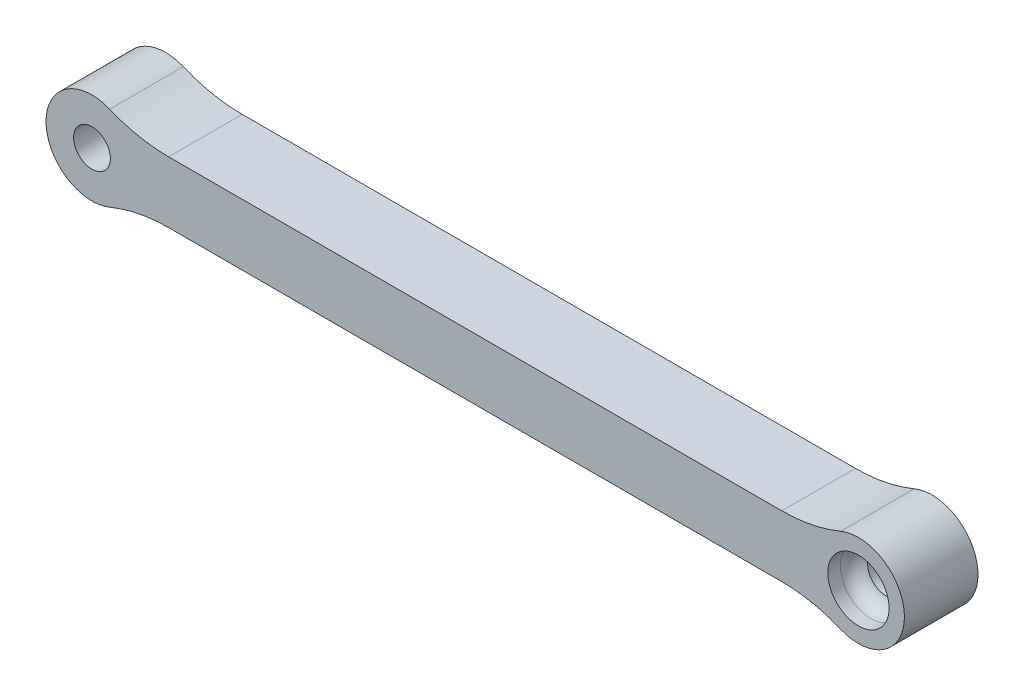
ISO-10303-21;
HEADER;
FILE_DESCRIPTION(('STEP AP214'),'2;1');
FILE_NAME('part.step','',(''),(''),'','','');
FILE_SCHEMA(('AUTOMOTIVE_DESIGN { 1 0 10303 214 1 1 1 1 }'));
ENDSEC;
DATA;
#1=APPLICATION_CONTEXT('core data for automotive mechanical design processes');
#2=APPLICATION_PROTOCOL_DEFINITION('international standard','automotive_design',2000,#1);
#3=PRODUCT_CONTEXT('',#1,'mechanical');
#4=PRODUCT('Part','Part','',(#3));
#5=PRODUCT_RELATED_PRODUCT_CATEGORY('part','',(#4));
#6=PRODUCT_DEFINITION_FORMATION('','',#4);
#7=PRODUCT_DEFINITION_CONTEXT('part definition',#1,'design');
#8=PRODUCT_DEFINITION('design','',#6,#7);
#9=PRODUCT_DEFINITION_SHAPE('','',#8);
#10=(LENGTH_UNIT() NAMED_UNIT(*) SI_UNIT(.MILLI.,.METRE.));
#11=(NAMED_UNIT(*) PLANE_ANGLE_UNIT() SI_UNIT($,.RADIAN.));
#12=(NAMED_UNIT(*) SI_UNIT($,.STERADIAN.) SOLID_ANGLE_UNIT());
#13=UNCERTAINTY_MEASURE_WITH_UNIT(LENGTH_MEASURE(1.E-05),#10,'distance_accuracy_value','');
#14=(GEOMETRIC_REPRESENTATION_CONTEXT(3) GLOBAL_UNCERTAINTY_ASSIGNED_CONTEXT((#13)) GLOBAL_UNIT_ASSIGNED_CONTEXT((#10,
#11,#12)) REPRESENTATION_CONTEXT('',''));
#15=CARTESIAN_POINT('',(0.,0.,0.));
#16=DIRECTION('',(0.,0.,1.));
#17=DIRECTION('',(1.,0.,0.));
#18=AXIS2_PLACEMENT_3D('',#15,#16,#17);
#19=CARTESIAN_POINT('',(50.,0.,4.8));
#20=DIRECTION('',(0.,0.,-1.));
#21=DIRECTION('',(-1.,0.,0.));
#22=AXIS2_PLACEMENT_3D('',#19,#20,#21);
#23=CYLINDRICAL_SURFACE('',#22,1.2);
#24=CARTESIAN_POINT('',(50.,0.,0.));
#25=DIRECTION('',(0.,0.,1.));
#26=DIRECTION('',(1.,0.,0.));
#27=AXIS2_PLACEMENT_3D('',#24,#25,#26);
#28=CIRCLE('',#27,1.2);
#29=CARTESIAN_POINT('',(51.2,0.,0.));
#30=VERTEX_POINT('',#29);
#31=EDGE_CURVE('E168',#30,#30,#28,.T.);
#32=ORIENTED_EDGE('',*,*,#31,.F.);
#33=EDGE_LOOP('',(#32));
#34=FACE_BOUND('',#33,.T.);
#35=CARTESIAN_POINT('',(50.,0.,3.));
#36=DIRECTION('',(0.,0.,1.));
#37=DIRECTION('',(1.,0.,0.));
#38=AXIS2_PLACEMENT_3D('',#35,#36,#37);
#39=CIRCLE('',#38,1.2);
#40=CARTESIAN_POINT('',(51.2,0.,3.));
#41=VERTEX_POINT('',#40);
#42=EDGE_CURVE('E166',#41,#41,#39,.T.);
#43=ORIENTED_EDGE('',*,*,#42,.T.);
#44=EDGE_LOOP('',(#43));
#45=FACE_BOUND('',#44,.T.);
#46=ADVANCED_FACE('F39',(#34,#45),#23,.F.);
#47=CARTESIAN_POINT('',(5.,12.,4.8));
#48=DIRECTION('',(0.,0.,-1.));
#49=DIRECTION('',(-1.,0.,0.));
#50=AXIS2_PLACEMENT_3D('',#47,#48,#49);
#51=PLANE('',#50);
#52=CARTESIAN_POINT('',(50.,0.,4.8));
#53=DIRECTION('',(0.,0.,1.));
#54=DIRECTION('',(1.,0.,0.));
#55=AXIS2_PLACEMENT_3D('',#52,#53,#54);
#56=CIRCLE('',#55,2.);
#57=CARTESIAN_POINT('',(52.,0.,4.8));
#58=VERTEX_POINT('',#57);
#59=EDGE_CURVE('E169',#58,#58,#56,.T.);
#60=ORIENTED_EDGE('',*,*,#59,.F.);
#61=EDGE_LOOP('',(#60));
#62=FACE_BOUND('',#61,.T.);
#63=CARTESIAN_POINT('',(5.,12.,4.8));
#64=DIRECTION('',(0.,0.,-1.));
#65=DIRECTION('',(-1.,0.,0.));
#66=AXIS2_PLACEMENT_3D('',#63,#64,#65);
#67=CIRCLE('',#66,10.);
#68=CARTESIAN_POINT('',(5.,2.,4.8));
#69=VERTEX_POINT('',#68);
#70=CARTESIAN_POINT('',(1.15384615384616,2.76923076923077,4.8));
#71=VERTEX_POINT('',#70);
#72=EDGE_CURVE('E153',#69,#71,#67,.T.);
#73=ORIENTED_EDGE('',*,*,#72,.T.);
#74=CARTESIAN_POINT('',(0.,0.,4.8));
#75=DIRECTION('',(0.,0.,1.));
#76=DIRECTION('',(1.,0.,0.));
#77=AXIS2_PLACEMENT_3D('',#74,#75,#76);
#78=CIRCLE('',#77,3.);
#79=CARTESIAN_POINT('',(1.15384615384616,-2.76923076923077,4.8));
#80=VERTEX_POINT('',#79);
#81=EDGE_CURVE('E100',#71,#80,#78,.T.);
#82=ORIENTED_EDGE('',*,*,#81,.T.);
#83=CARTESIAN_POINT('',(5.,-12.,4.8));
#84=DIRECTION('',(0.,0.,-1.));
#85=DIRECTION('',(1.,0.,0.));
#86=AXIS2_PLACEMENT_3D('',#83,#84,#85);
#87=CIRCLE('',#86,10.);
#88=CARTESIAN_POINT('',(5.,-2.,4.8));
#89=VERTEX_POINT('',#88);
#90=EDGE_CURVE('E186',#80,#89,#87,.T.);
#91=ORIENTED_EDGE('',*,*,#90,.T.);
#92=DIRECTION('',(1.,0.,0.));
#93=VECTOR('',#92,1.);
#94=CARTESIAN_POINT('',(5.,-2.,4.8));
#95=LINE('',#94,#93);
#96=CARTESIAN_POINT('',(45.,-2.,4.8));
#97=VERTEX_POINT('',#96);
#98=EDGE_CURVE('E188',#89,#97,#95,.T.);
#99=ORIENTED_EDGE('',*,*,#98,.T.);
#100=CARTESIAN_POINT('',(45.,-12.,4.8));
#101=DIRECTION('',(0.,0.,-1.));
#102=DIRECTION('',(1.,0.,0.));
#103=AXIS2_PLACEMENT_3D('',#100,#101,#102);
#104=CIRCLE('',#103,10.);
#105=CARTESIAN_POINT('',(48.8461538461539,-2.76923076923076,4.8));
#106=VERTEX_POINT('',#105);
#107=EDGE_CURVE('E120',#97,#106,#104,.T.);
#108=ORIENTED_EDGE('',*,*,#107,.T.);
#109=CARTESIAN_POINT('',(50.,0.,4.8));
#110=DIRECTION('',(0.,0.,1.));
#111=DIRECTION('',(1.,0.,0.));
#112=AXIS2_PLACEMENT_3D('',#109,#110,#111);
#113=CIRCLE('',#112,2.99999999999999);
#114=CARTESIAN_POINT('',(48.8461538461539,2.76923076923076,4.8));
#115=VERTEX_POINT('',#114);
#116=EDGE_CURVE('E113',#106,#115,#113,.T.);
#117=ORIENTED_EDGE('',*,*,#116,.T.);
#118=CARTESIAN_POINT('',(45.,12.,4.8));
#119=DIRECTION('',(0.,0.,-1.));
#120=DIRECTION('',(1.,0.,0.));
#121=AXIS2_PLACEMENT_3D('',#118,#119,#120);
#122=CIRCLE('',#121,10.);
#123=CARTESIAN_POINT('',(45.,2.,4.8));
#124=VERTEX_POINT('',#123);
#125=EDGE_CURVE('E118',#115,#124,#122,.T.);
#126=ORIENTED_EDGE('',*,*,#125,.T.);
#127=DIRECTION('',(-1.,0.,0.));
#128=VECTOR('',#127,1.);
#129=CARTESIAN_POINT('',(5.,2.,4.8));
#130=LINE('',#129,#128);
#131=EDGE_CURVE('E56',#124,#69,#130,.T.);
#132=ORIENTED_EDGE('',*,*,#131,.T.);
#133=EDGE_LOOP('',(#73,#82,#91,#99,#108,#117,#126,#132));
#134=FACE_BOUND('',#133,.T.);
#135=CARTESIAN_POINT('',(0.,0.,4.8));
#136=DIRECTION('',(0.,0.,1.));
#137=DIRECTION('',(1.,0.,0.));
#138=AXIS2_PLACEMENT_3D('',#135,#136,#137);
#139=CIRCLE('',#138,1.2);
#140=CARTESIAN_POINT('',(1.2,0.,4.8));
#141=VERTEX_POINT('',#140);
#142=EDGE_CURVE('E142',#141,#141,#139,.T.);
#143=ORIENTED_EDGE('',*,*,#142,.F.);
#144=EDGE_LOOP('',(#143));
#145=FACE_BOUND('',#144,.T.);
#146=ADVANCED_FACE('F115',(#62,#134,#145),#51,.F.);
#147=CARTESIAN_POINT('',(5.,12.,0.));
#148=DIRECTION('',(0.,0.,-1.));
#149=DIRECTION('',(-1.,0.,0.));
#150=AXIS2_PLACEMENT_3D('',#147,#148,#149);
#151=PLANE('',#150);
#152=CARTESIAN_POINT('',(0.,0.,0.));
#153=DIRECTION('',(0.,0.,1.));
#154=DIRECTION('',(1.,0.,0.));
#155=AXIS2_PLACEMENT_3D('',#152,#153,#154);
#156=CIRCLE('',#155,1.2);
#157=CARTESIAN_POINT('',(1.2,0.,0.));
#158=VERTEX_POINT('',#157);
#159=EDGE_CURVE('E173',#158,#158,#156,.T.);
#160=ORIENTED_EDGE('',*,*,#159,.T.);
#161=EDGE_LOOP('',(#160));
#162=FACE_BOUND('',#161,.T.);
#163=CARTESIAN_POINT('',(5.,12.,0.));
#164=DIRECTION('',(0.,0.,-1.));
#165=DIRECTION('',(-1.,0.,0.));
#166=AXIS2_PLACEMENT_3D('',#163,#164,#165);
#167=CIRCLE('',#166,10.);
#168=CARTESIAN_POINT('',(5.,2.,0.));
#169=VERTEX_POINT('',#168);
#170=CARTESIAN_POINT('',(1.15384615384616,2.76923076923077,0.));
#171=VERTEX_POINT('',#170);
#172=EDGE_CURVE('E138',#169,#171,#167,.T.);
#173=ORIENTED_EDGE('',*,*,#172,.F.);
#174=DIRECTION('',(-1.,0.,0.));
#175=VECTOR('',#174,1.);
#176=CARTESIAN_POINT('',(5.,2.,0.));
#177=LINE('',#176,#175);
#178=CARTESIAN_POINT('',(45.,2.,0.));
#179=VERTEX_POINT('',#178);
#180=EDGE_CURVE('E91',#179,#169,#177,.T.);
#181=ORIENTED_EDGE('',*,*,#180,.F.);
#182=CARTESIAN_POINT('',(45.,12.,0.));
#183=DIRECTION('',(0.,0.,-1.));
#184=DIRECTION('',(1.,0.,0.));
#185=AXIS2_PLACEMENT_3D('',#182,#183,#184);
#186=CIRCLE('',#185,10.);
#187=CARTESIAN_POINT('',(48.8461538461539,2.76923076923076,0.));
#188=VERTEX_POINT('',#187);
#189=EDGE_CURVE('E85',#188,#179,#186,.T.);
#190=ORIENTED_EDGE('',*,*,#189,.F.);
#191=CARTESIAN_POINT('',(50.,0.,0.));
#192=DIRECTION('',(0.,0.,1.));
#193=DIRECTION('',(1.,0.,0.));
#194=AXIS2_PLACEMENT_3D('',#191,#192,#193);
#195=CIRCLE('',#194,2.99999999999999);
#196=CARTESIAN_POINT('',(48.8461538461539,-2.76923076923076,0.));
#197=VERTEX_POINT('',#196);
#198=EDGE_CURVE('E128',#197,#188,#195,.T.);
#199=ORIENTED_EDGE('',*,*,#198,.F.);
#200=CARTESIAN_POINT('',(45.,-12.,0.));
#201=DIRECTION('',(0.,0.,-1.));
#202=DIRECTION('',(1.,0.,0.));
#203=AXIS2_PLACEMENT_3D('',#200,#201,#202);
#204=CIRCLE('',#203,10.);
#205=CARTESIAN_POINT('',(45.,-2.,0.));
#206=VERTEX_POINT('',#205);
#207=EDGE_CURVE('E148',#206,#197,#204,.T.);
#208=ORIENTED_EDGE('',*,*,#207,.F.);
#209=DIRECTION('',(1.,0.,0.));
#210=VECTOR('',#209,1.);
#211=CARTESIAN_POINT('',(5.,-2.,0.));
#212=LINE('',#211,#210);
#213=CARTESIAN_POINT('',(5.,-2.,0.));
#214=VERTEX_POINT('',#213);
#215=EDGE_CURVE('E146',#214,#206,#212,.T.);
#216=ORIENTED_EDGE('',*,*,#215,.F.);
#217=CARTESIAN_POINT('',(5.,-12.,0.));
#218=DIRECTION('',(0.,0.,-1.));
#219=DIRECTION('',(1.,0.,0.));
#220=AXIS2_PLACEMENT_3D('',#217,#218,#219);
#221=CIRCLE('',#220,10.);
#222=CARTESIAN_POINT('',(1.15384615384616,-2.76923076923077,0.));
#223=VERTEX_POINT('',#222);
#224=EDGE_CURVE('E144',#223,#214,#221,.T.);
#225=ORIENTED_EDGE('',*,*,#224,.F.);
#226=CARTESIAN_POINT('',(0.,0.,0.));
#227=DIRECTION('',(0.,0.,1.));
#228=DIRECTION('',(1.,0.,0.));
#229=AXIS2_PLACEMENT_3D('',#226,#227,#228);
#230=CIRCLE('',#229,3.);
#231=EDGE_CURVE('E141',#171,#223,#230,.T.);
#232=ORIENTED_EDGE('',*,*,#231,.F.);
#233=EDGE_LOOP('',(#173,#181,#190,#199,#208,#216,#225,#232));
#234=FACE_BOUND('',#233,.T.);
#235=ORIENTED_EDGE('',*,*,#31,.T.);
#236=EDGE_LOOP('',(#235));
#237=FACE_BOUND('',#236,.T.);
#238=ADVANCED_FACE('F201',(#162,#234,#237),#151,.T.);
#239=CARTESIAN_POINT('',(5.,12.,4.8));
#240=DIRECTION('',(0.,0.,-1.));
#241=DIRECTION('',(-1.,0.,0.));
#242=AXIS2_PLACEMENT_3D('',#239,#240,#241);
#243=CYLINDRICAL_SURFACE('',#242,10.);
#244=ORIENTED_EDGE('',*,*,#172,.T.);
#245=DIRECTION('',(0.,0.,-1.));
#246=VECTOR('',#245,1.);
#247=CARTESIAN_POINT('',(1.15384615384616,2.76923076923077,4.8));
#248=LINE('',#247,#246);
#249=EDGE_CURVE('E48',#71,#171,#248,.T.);
#250=ORIENTED_EDGE('',*,*,#249,.F.);
#251=ORIENTED_EDGE('',*,*,#72,.F.);
#252=DIRECTION('',(0.,0.,-1.));
#253=VECTOR('',#252,1.);
#254=CARTESIAN_POINT('',(5.,2.,4.8));
#255=LINE('',#254,#253);
#256=EDGE_CURVE('E134',#69,#169,#255,.T.);
#257=ORIENTED_EDGE('',*,*,#256,.T.);
#258=EDGE_LOOP('',(#244,#250,#251,#257));
#259=FACE_BOUND('',#258,.T.);
#260=ADVANCED_FACE('F206',(#259),#243,.F.);
#261=CARTESIAN_POINT('',(0.,0.,4.8));
#262=DIRECTION('',(0.,0.,-1.));
#263=DIRECTION('',(-1.,0.,0.));
#264=AXIS2_PLACEMENT_3D('',#261,#262,#263);
#265=CYLINDRICAL_SURFACE('',#264,3.);
#266=ORIENTED_EDGE('',*,*,#231,.T.);
#267=DIRECTION('',(0.,0.,-1.));
#268=VECTOR('',#267,1.);
#269=CARTESIAN_POINT('',(1.15384615384616,-2.76923076923077,4.8));
#270=LINE('',#269,#268);
#271=EDGE_CURVE('E163',#80,#223,#270,.T.);
#272=ORIENTED_EDGE('',*,*,#271,.F.);
#273=ORIENTED_EDGE('',*,*,#81,.F.);
#274=ORIENTED_EDGE('',*,*,#249,.T.);
#275=EDGE_LOOP('',(#266,#272,#273,#274));
#276=FACE_BOUND('',#275,.T.);
#277=ADVANCED_FACE('F236',(#276),#265,.T.);
#278=CARTESIAN_POINT('',(5.,-12.,4.8));
#279=DIRECTION('',(0.,0.,-1.));
#280=DIRECTION('',(-1.,0.,0.));
#281=AXIS2_PLACEMENT_3D('',#278,#279,#280);
#282=CYLINDRICAL_SURFACE('',#281,10.);
#283=ORIENTED_EDGE('',*,*,#224,.T.);
#284=DIRECTION('',(0.,0.,-1.));
#285=VECTOR('',#284,1.);
#286=CARTESIAN_POINT('',(5.,-2.,4.8));
#287=LINE('',#286,#285);
#288=EDGE_CURVE('E160',#89,#214,#287,.T.);
#289=ORIENTED_EDGE('',*,*,#288,.F.);
#290=ORIENTED_EDGE('',*,*,#90,.F.);
#291=ORIENTED_EDGE('',*,*,#271,.T.);
#292=EDGE_LOOP('',(#283,#289,#290,#291));
#293=FACE_BOUND('',#292,.T.);
#294=ADVANCED_FACE('F242',(#293),#282,.F.);
#295=CARTESIAN_POINT('',(5.,-2.,4.8));
#296=DIRECTION('',(0.,1.,0.));
#297=DIRECTION('',(0.,0.,1.));
#298=AXIS2_PLACEMENT_3D('',#295,#296,#297);
#299=PLANE('',#298);
#300=ORIENTED_EDGE('',*,*,#215,.T.);
#301=DIRECTION('',(0.,0.,-1.));
#302=VECTOR('',#301,1.);
#303=CARTESIAN_POINT('',(45.,-2.,4.8));
#304=LINE('',#303,#302);
#305=EDGE_CURVE('E157',#97,#206,#304,.T.);
#306=ORIENTED_EDGE('',*,*,#305,.F.);
#307=ORIENTED_EDGE('',*,*,#98,.F.);
#308=ORIENTED_EDGE('',*,*,#288,.T.);
#309=EDGE_LOOP('',(#300,#306,#307,#308));
#310=FACE_BOUND('',#309,.T.);
#311=ADVANCED_FACE('F194',(#310),#299,.F.);
#312=CARTESIAN_POINT('',(45.,-12.,4.8));
#313=DIRECTION('',(0.,0.,-1.));
#314=DIRECTION('',(-1.,0.,0.));
#315=AXIS2_PLACEMENT_3D('',#312,#313,#314);
#316=CYLINDRICAL_SURFACE('',#315,10.);
#317=ORIENTED_EDGE('',*,*,#207,.T.);
#318=DIRECTION('',(0.,0.,-1.));
#319=VECTOR('',#318,1.);
#320=CARTESIAN_POINT('',(48.8461538461539,-2.76923076923076,4.8));
#321=LINE('',#320,#319);
#322=EDGE_CURVE('E129',#106,#197,#321,.T.);
#323=ORIENTED_EDGE('',*,*,#322,.F.);
#324=ORIENTED_EDGE('',*,*,#107,.F.);
#325=ORIENTED_EDGE('',*,*,#305,.T.);
#326=EDGE_LOOP('',(#317,#323,#324,#325));
#327=FACE_BOUND('',#326,.T.);
#328=ADVANCED_FACE('F198',(#327),#316,.F.);
#329=CARTESIAN_POINT('',(50.,0.,4.8));
#330=DIRECTION('',(0.,0.,-1.));
#331=DIRECTION('',(-1.,0.,0.));
#332=AXIS2_PLACEMENT_3D('',#329,#330,#331);
#333=CYLINDRICAL_SURFACE('',#332,2.99999999999999);
#334=ORIENTED_EDGE('',*,*,#198,.T.);
#335=DIRECTION('',(0.,0.,-1.));
#336=VECTOR('',#335,1.);
#337=CARTESIAN_POINT('',(48.8461538461539,2.76923076923076,4.8));
#338=LINE('',#337,#336);
#339=EDGE_CURVE('E125',#115,#188,#338,.T.);
#340=ORIENTED_EDGE('',*,*,#339,.F.);
#341=ORIENTED_EDGE('',*,*,#116,.F.);
#342=ORIENTED_EDGE('',*,*,#322,.T.);
#343=EDGE_LOOP('',(#334,#340,#341,#342));
#344=FACE_BOUND('',#343,.T.);
#345=ADVANCED_FACE('F126',(#344),#333,.T.);
#346=CARTESIAN_POINT('',(45.,12.,4.8));
#347=DIRECTION('',(0.,0.,-1.));
#348=DIRECTION('',(-1.,0.,0.));
#349=AXIS2_PLACEMENT_3D('',#346,#347,#348);
#350=CYLINDRICAL_SURFACE('',#349,10.);
#351=ORIENTED_EDGE('',*,*,#189,.T.);
#352=DIRECTION('',(0.,0.,-1.));
#353=VECTOR('',#352,1.);
#354=CARTESIAN_POINT('',(45.,2.,4.8));
#355=LINE('',#354,#353);
#356=EDGE_CURVE('E130',#124,#179,#355,.T.);
#357=ORIENTED_EDGE('',*,*,#356,.F.);
#358=ORIENTED_EDGE('',*,*,#125,.F.);
#359=ORIENTED_EDGE('',*,*,#339,.T.);
#360=EDGE_LOOP('',(#351,#357,#358,#359));
#361=FACE_BOUND('',#360,.T.);
#362=ADVANCED_FACE('F132',(#361),#350,.F.);
#363=CARTESIAN_POINT('',(5.,2.,4.8));
#364=DIRECTION('',(0.,-1.,0.));
#365=DIRECTION('',(0.,0.,-1.));
#366=AXIS2_PLACEMENT_3D('',#363,#364,#365);
#367=PLANE('',#366);
#368=ORIENTED_EDGE('',*,*,#180,.T.);
#369=ORIENTED_EDGE('',*,*,#256,.F.);
#370=ORIENTED_EDGE('',*,*,#131,.F.);
#371=ORIENTED_EDGE('',*,*,#356,.T.);
#372=EDGE_LOOP('',(#368,#369,#370,#371));
#373=FACE_BOUND('',#372,.T.);
#374=ADVANCED_FACE('F208',(#373),#367,.F.);
#375=CARTESIAN_POINT('',(0.,0.,4.8));
#376=DIRECTION('',(0.,0.,-1.));
#377=DIRECTION('',(-1.,0.,0.));
#378=AXIS2_PLACEMENT_3D('',#375,#376,#377);
#379=CYLINDRICAL_SURFACE('',#378,1.2);
#380=ORIENTED_EDGE('',*,*,#142,.T.);
#381=EDGE_LOOP('',(#380));
#382=FACE_BOUND('',#381,.T.);
#383=ORIENTED_EDGE('',*,*,#159,.F.);
#384=EDGE_LOOP('',(#383));
#385=FACE_BOUND('',#384,.T.);
#386=ADVANCED_FACE('F210',(#382,#385),#379,.F.);
#387=CARTESIAN_POINT('',(50.,0.,3.));
#388=DIRECTION('',(0.,0.,1.));
#389=DIRECTION('',(1.,0.,0.));
#390=AXIS2_PLACEMENT_3D('',#387,#388,#389);
#391=CYLINDRICAL_SURFACE('',#390,2.);
#392=CARTESIAN_POINT('',(50.,0.,3.97979589711327));
#393=DIRECTION('',(0.,0.,-1.));
#394=DIRECTION('',(-1.,0.,0.));
#395=AXIS2_PLACEMENT_3D('',#392,#393,#394);
#396=CIRCLE('',#395,2.);
#397=CARTESIAN_POINT('',(48.,0.,3.97979589711327));
#398=VERTEX_POINT('',#397);
#399=EDGE_CURVE('E11',#398,#398,#396,.T.);
#400=ORIENTED_EDGE('',*,*,#399,.T.);
#401=EDGE_LOOP('',(#400));
#402=FACE_BOUND('',#401,.T.);
#403=ORIENTED_EDGE('',*,*,#59,.T.);
#404=EDGE_LOOP('',(#403));
#405=FACE_BOUND('',#404,.T.);
#406=ADVANCED_FACE('F216',(#402,#405),#391,.F.);
#407=CARTESIAN_POINT('',(50.,0.,3.97979589711327));
#408=DIRECTION('',(0.,0.,-1.));
#409=DIRECTION('',(-1.,0.,0.));
#410=AXIS2_PLACEMENT_3D('',#407,#408,#409);
#411=TOROIDAL_SURFACE('',#410,1.,1.);
#412=ORIENTED_EDGE('',*,*,#399,.F.);
#413=EDGE_LOOP('',(#412));
#414=FACE_BOUND('',#413,.T.);
#415=ORIENTED_EDGE('',*,*,#42,.F.);
#416=EDGE_LOOP('',(#415));
#417=FACE_BOUND('',#416,.T.);
#418=ADVANCED_FACE('F41',(#414,#417),#411,.F.);
#419=CLOSED_SHELL('',(#46,#146,#238,#260,#277,#294,#311,#328,#345,#362,#374,#386,#406,#418));
#420=MANIFOLD_SOLID_BREP('B2',#419);
#421=ADVANCED_BREP_SHAPE_REPRESENTATION('',(#18,#420),#14);
#422=SHAPE_DEFINITION_REPRESENTATION(#9,#421);
ENDSEC;
END-ISO-10303-21;
